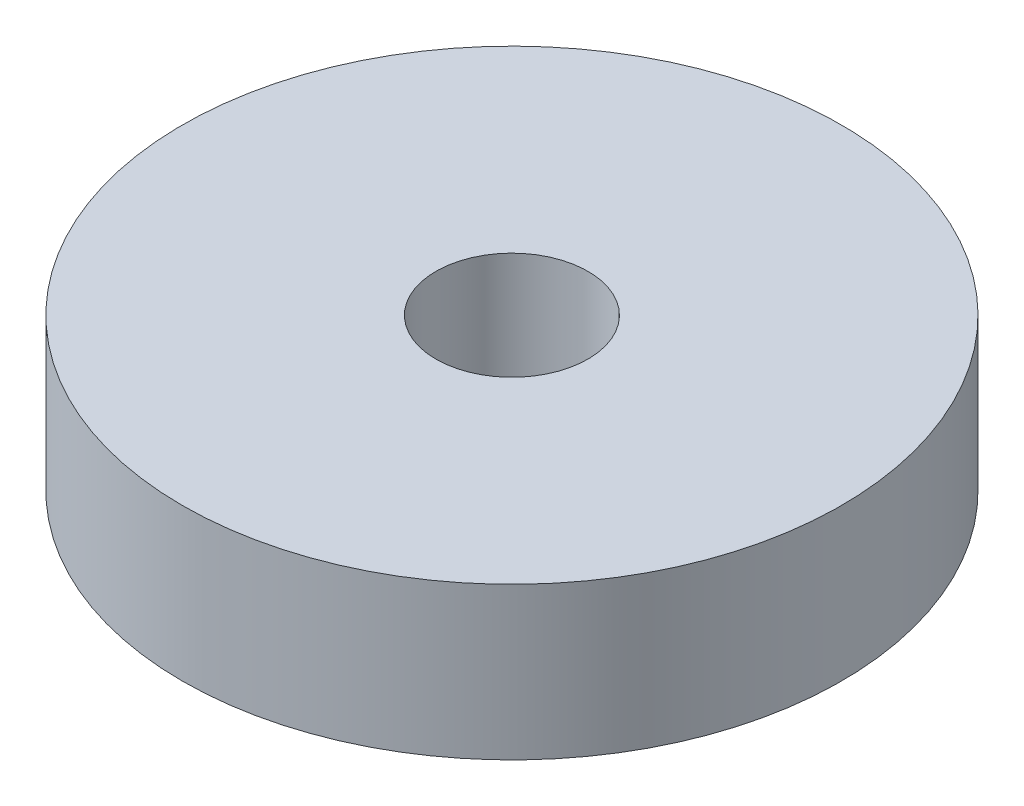
ISO-10303-21;
HEADER;
FILE_DESCRIPTION(('STEP AP214'),'2;1');
FILE_NAME('part.step','',(''),(''),'','','');
FILE_SCHEMA(('AUTOMOTIVE_DESIGN { 1 0 10303 214 1 1 1 1 }'));
ENDSEC;
DATA;
#1=APPLICATION_CONTEXT('core data for automotive mechanical design processes');
#2=APPLICATION_PROTOCOL_DEFINITION('international standard','automotive_design',2000,#1);
#3=PRODUCT_CONTEXT('',#1,'mechanical');
#4=PRODUCT('Part','Part','',(#3));
#5=PRODUCT_RELATED_PRODUCT_CATEGORY('part','',(#4));
#6=PRODUCT_DEFINITION_FORMATION('','',#4);
#7=PRODUCT_DEFINITION_CONTEXT('part definition',#1,'design');
#8=PRODUCT_DEFINITION('design','',#6,#7);
#9=PRODUCT_DEFINITION_SHAPE('','',#8);
#10=(LENGTH_UNIT() NAMED_UNIT(*) SI_UNIT(.MILLI.,.METRE.));
#11=(NAMED_UNIT(*) PLANE_ANGLE_UNIT() SI_UNIT($,.RADIAN.));
#12=(NAMED_UNIT(*) SI_UNIT($,.STERADIAN.) SOLID_ANGLE_UNIT());
#13=UNCERTAINTY_MEASURE_WITH_UNIT(LENGTH_MEASURE(1.E-05),#10,'distance_accuracy_value','');
#14=(GEOMETRIC_REPRESENTATION_CONTEXT(3) GLOBAL_UNCERTAINTY_ASSIGNED_CONTEXT((#13)) GLOBAL_UNIT_ASSIGNED_CONTEXT((#10,
#11,#12)) REPRESENTATION_CONTEXT('',''));
#15=CARTESIAN_POINT('',(0.,0.,0.));
#16=DIRECTION('',(0.,0.,1.));
#17=DIRECTION('',(1.,0.,0.));
#18=AXIS2_PLACEMENT_3D('',#15,#16,#17);
#19=CARTESIAN_POINT('',(0.,15.,0.));
#20=DIRECTION('',(0.,1.,0.));
#21=DIRECTION('',(0.,0.,1.));
#22=AXIS2_PLACEMENT_3D('',#19,#20,#21);
#23=PLANE('',#22);
#24=CARTESIAN_POINT('',(0.,15.,0.));
#25=DIRECTION('',(0.,1.,0.));
#26=DIRECTION('',(0.,0.,1.));
#27=AXIS2_PLACEMENT_3D('',#24,#25,#26);
#28=CIRCLE('',#27,32.5);
#29=CARTESIAN_POINT('',(0.,15.,32.5));
#30=VERTEX_POINT('',#29);
#31=EDGE_CURVE('E10',#30,#30,#28,.T.);
#32=ORIENTED_EDGE('',*,*,#31,.T.);
#33=EDGE_LOOP('',(#32));
#34=FACE_BOUND('',#33,.T.);
#35=CARTESIAN_POINT('',(0.,15.,0.));
#36=DIRECTION('',(0.,1.,0.));
#37=DIRECTION('',(0.,0.,1.));
#38=AXIS2_PLACEMENT_3D('',#35,#36,#37);
#39=CIRCLE('',#38,7.5);
#40=CARTESIAN_POINT('',(0.,15.,7.5));
#41=VERTEX_POINT('',#40);
#42=EDGE_CURVE('E50',#41,#41,#39,.T.);
#43=ORIENTED_EDGE('',*,*,#42,.F.);
#44=EDGE_LOOP('',(#43));
#45=FACE_BOUND('',#44,.T.);
#46=ADVANCED_FACE('F37',(#34,#45),#23,.T.);
#47=CARTESIAN_POINT('',(0.,0.,0.));
#48=DIRECTION('',(0.,1.,0.));
#49=DIRECTION('',(0.,0.,1.));
#50=AXIS2_PLACEMENT_3D('',#47,#48,#49);
#51=PLANE('',#50);
#52=CARTESIAN_POINT('',(0.,0.,0.));
#53=DIRECTION('',(0.,1.,0.));
#54=DIRECTION('',(0.,0.,1.));
#55=AXIS2_PLACEMENT_3D('',#52,#53,#54);
#56=CIRCLE('',#55,32.5);
#57=CARTESIAN_POINT('',(0.,0.,32.5));
#58=VERTEX_POINT('',#57);
#59=EDGE_CURVE('E41',#58,#58,#56,.T.);
#60=ORIENTED_EDGE('',*,*,#59,.F.);
#61=EDGE_LOOP('',(#60));
#62=FACE_BOUND('',#61,.T.);
#63=CARTESIAN_POINT('',(0.,0.,0.));
#64=DIRECTION('',(0.,1.,0.));
#65=DIRECTION('',(0.,0.,1.));
#66=AXIS2_PLACEMENT_3D('',#63,#64,#65);
#67=CIRCLE('',#66,7.5);
#68=CARTESIAN_POINT('',(0.,0.,7.5));
#69=VERTEX_POINT('',#68);
#70=EDGE_CURVE('E52',#69,#69,#67,.T.);
#71=ORIENTED_EDGE('',*,*,#70,.T.);
#72=EDGE_LOOP('',(#71));
#73=FACE_BOUND('',#72,.T.);
#74=ADVANCED_FACE('F64',(#62,#73),#51,.F.);
#75=CARTESIAN_POINT('',(0.,15.,0.));
#76=DIRECTION('',(0.,-1.,0.));
#77=DIRECTION('',(0.,0.,-1.));
#78=AXIS2_PLACEMENT_3D('',#75,#76,#77);
#79=CYLINDRICAL_SURFACE('',#78,32.5);
#80=ORIENTED_EDGE('',*,*,#31,.F.);
#81=EDGE_LOOP('',(#80));
#82=FACE_BOUND('',#81,.T.);
#83=ORIENTED_EDGE('',*,*,#59,.T.);
#84=EDGE_LOOP('',(#83));
#85=FACE_BOUND('',#84,.T.);
#86=ADVANCED_FACE('F39',(#82,#85),#79,.T.);
#87=CARTESIAN_POINT('',(0.,15.,0.));
#88=DIRECTION('',(0.,-1.,0.));
#89=DIRECTION('',(0.,0.,-1.));
#90=AXIS2_PLACEMENT_3D('',#87,#88,#89);
#91=CYLINDRICAL_SURFACE('',#90,7.5);
#92=ORIENTED_EDGE('',*,*,#42,.T.);
#93=EDGE_LOOP('',(#92));
#94=FACE_BOUND('',#93,.T.);
#95=ORIENTED_EDGE('',*,*,#70,.F.);
#96=EDGE_LOOP('',(#95));
#97=FACE_BOUND('',#96,.T.);
#98=ADVANCED_FACE('F60',(#94,#97),#91,.F.);
#99=CLOSED_SHELL('',(#46,#74,#86,#98));
#100=MANIFOLD_SOLID_BREP('B2',#99);
#101=ADVANCED_BREP_SHAPE_REPRESENTATION('',(#18,#100),#14);
#102=SHAPE_DEFINITION_REPRESENTATION(#9,#101);
ENDSEC;
END-ISO-10303-21;
